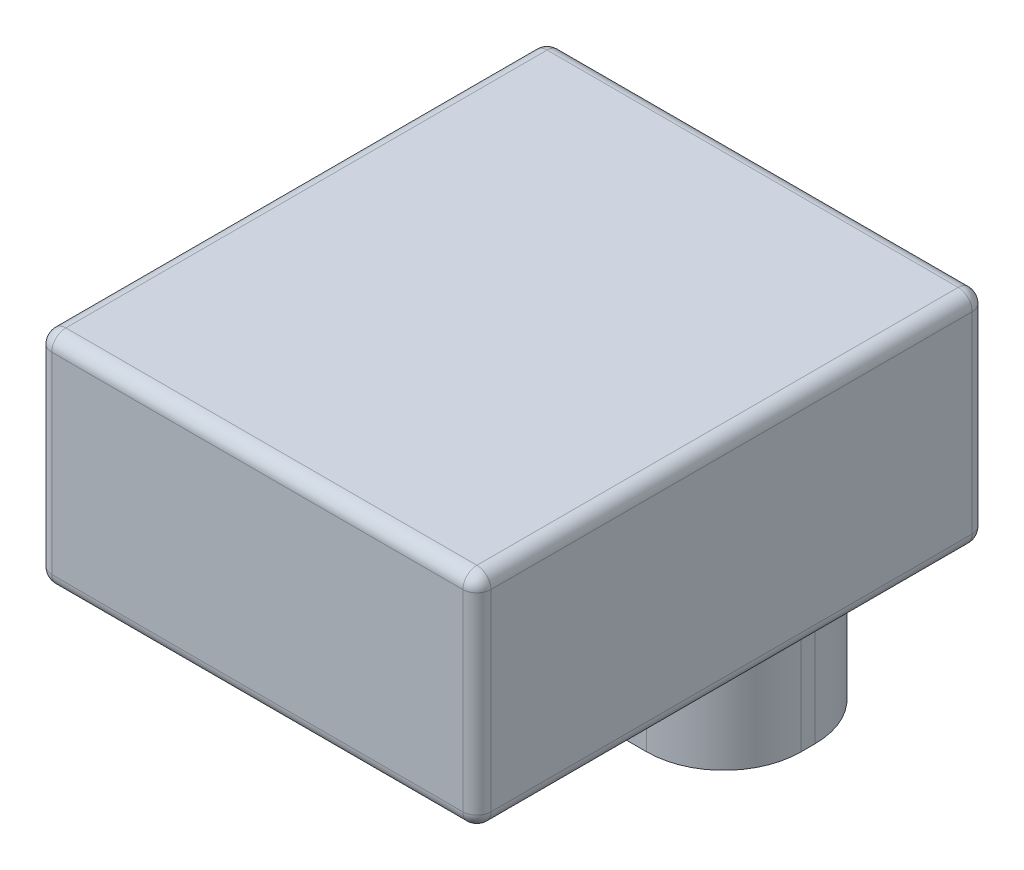
ISO-10303-21;
HEADER;
FILE_DESCRIPTION(('STEP AP214'),'2;1');
FILE_NAME('part.step','',(''),(''),'','','');
FILE_SCHEMA(('AUTOMOTIVE_DESIGN { 1 0 10303 214 1 1 1 1 }'));
ENDSEC;
DATA;
#1=APPLICATION_CONTEXT('core data for automotive mechanical design processes');
#2=APPLICATION_PROTOCOL_DEFINITION('international standard','automotive_design',2000,#1);
#3=PRODUCT_CONTEXT('',#1,'mechanical');
#4=PRODUCT('Part','Part','',(#3));
#5=PRODUCT_RELATED_PRODUCT_CATEGORY('part','',(#4));
#6=PRODUCT_DEFINITION_FORMATION('','',#4);
#7=PRODUCT_DEFINITION_CONTEXT('part definition',#1,'design');
#8=PRODUCT_DEFINITION('design','',#6,#7);
#9=PRODUCT_DEFINITION_SHAPE('','',#8);
#10=(LENGTH_UNIT() NAMED_UNIT(*) SI_UNIT(.MILLI.,.METRE.));
#11=(NAMED_UNIT(*) PLANE_ANGLE_UNIT() SI_UNIT($,.RADIAN.));
#12=(NAMED_UNIT(*) SI_UNIT($,.STERADIAN.) SOLID_ANGLE_UNIT());
#13=UNCERTAINTY_MEASURE_WITH_UNIT(LENGTH_MEASURE(1.E-05),#10,'distance_accuracy_value','');
#14=(GEOMETRIC_REPRESENTATION_CONTEXT(3) GLOBAL_UNCERTAINTY_ASSIGNED_CONTEXT((#13)) GLOBAL_UNIT_ASSIGNED_CONTEXT((#10,
#11,#12)) REPRESENTATION_CONTEXT('',''));
#15=CARTESIAN_POINT('',(0.,0.,0.));
#16=DIRECTION('',(0.,0.,1.));
#17=DIRECTION('',(1.,0.,0.));
#18=AXIS2_PLACEMENT_3D('',#15,#16,#17);
#19=CARTESIAN_POINT('',(0.,0.,0.));
#20=DIRECTION('',(0.,1.,0.));
#21=DIRECTION('',(0.,0.,1.));
#22=AXIS2_PLACEMENT_3D('',#19,#20,#21);
#23=PLANE('',#22);
#24=DIRECTION('',(-1.,0.,0.));
#25=VECTOR('',#24,1.);
#26=CARTESIAN_POINT('',(0.,0.,-34.3));
#27=LINE('',#26,#25);
#28=CARTESIAN_POINT('',(-29.3,0.,-34.3));
#29=VERTEX_POINT('',#28);
#30=CARTESIAN_POINT('',(29.3,0.,-34.3));
#31=VERTEX_POINT('',#30);
#32=EDGE_CURVE('E241',#29,#31,#27,.F.);
#33=ORIENTED_EDGE('',*,*,#32,.T.);
#34=DIRECTION('',(0.,0.,-1.));
#35=VECTOR('',#34,1.);
#36=CARTESIAN_POINT('',(29.3,0.,0.));
#37=LINE('',#36,#35);
#38=CARTESIAN_POINT('',(29.3,0.,34.3));
#39=VERTEX_POINT('',#38);
#40=EDGE_CURVE('E244',#31,#39,#37,.F.);
#41=ORIENTED_EDGE('',*,*,#40,.T.);
#42=DIRECTION('',(1.,0.,0.));
#43=VECTOR('',#42,1.);
#44=CARTESIAN_POINT('',(0.,0.,34.3));
#45=LINE('',#44,#43);
#46=CARTESIAN_POINT('',(-29.3,0.,34.3));
#47=VERTEX_POINT('',#46);
#48=EDGE_CURVE('E239',#39,#47,#45,.F.);
#49=ORIENTED_EDGE('',*,*,#48,.T.);
#50=DIRECTION('',(0.,0.,1.));
#51=VECTOR('',#50,1.);
#52=CARTESIAN_POINT('',(-29.3,0.,0.));
#53=LINE('',#52,#51);
#54=EDGE_CURVE('E237',#47,#29,#53,.F.);
#55=ORIENTED_EDGE('',*,*,#54,.T.);
#56=EDGE_LOOP('',(#33,#41,#49,#55));
#57=FACE_BOUND('',#56,.T.);
#58=DIRECTION('',(0.,0.,-1.));
#59=VECTOR('',#58,1.);
#60=CARTESIAN_POINT('',(-25.,0.,-5.2));
#61=LINE('',#60,#59);
#62=CARTESIAN_POINT('',(-25.,0.,-16.2));
#63=VERTEX_POINT('',#62);
#64=CARTESIAN_POINT('',(-25.,0.,-18.2));
#65=VERTEX_POINT('',#64);
#66=EDGE_CURVE('E313',#63,#65,#61,.T.);
#67=ORIENTED_EDGE('',*,*,#66,.F.);
#68=CARTESIAN_POINT('',(-14.,0.,-16.2));
#69=DIRECTION('',(0.,1.,0.));
#70=DIRECTION('',(0.,0.,1.));
#71=AXIS2_PLACEMENT_3D('',#68,#69,#70);
#72=CIRCLE('',#71,11.);
#73=CARTESIAN_POINT('',(-14.,0.,-5.2));
#74=VERTEX_POINT('',#73);
#75=EDGE_CURVE('E11',#63,#74,#72,.T.);
#76=ORIENTED_EDGE('',*,*,#75,.T.);
#77=DIRECTION('',(-1.,0.,0.));
#78=VECTOR('',#77,1.);
#79=CARTESIAN_POINT('',(-25.,0.,-5.2));
#80=LINE('',#79,#78);
#81=CARTESIAN_POINT('',(14.,0.,-5.2));
#82=VERTEX_POINT('',#81);
#83=EDGE_CURVE('E378',#82,#74,#80,.T.);
#84=ORIENTED_EDGE('',*,*,#83,.F.);
#85=CARTESIAN_POINT('',(14.,0.,-16.2));
#86=DIRECTION('',(0.,1.,0.));
#87=DIRECTION('',(0.,0.,1.));
#88=AXIS2_PLACEMENT_3D('',#85,#86,#87);
#89=CIRCLE('',#88,11.);
#90=CARTESIAN_POINT('',(25.,0.,-16.2));
#91=VERTEX_POINT('',#90);
#92=EDGE_CURVE('E340',#82,#91,#89,.T.);
#93=ORIENTED_EDGE('',*,*,#92,.T.);
#94=DIRECTION('',(0.,0.,1.));
#95=VECTOR('',#94,1.);
#96=CARTESIAN_POINT('',(25.,0.,-5.2));
#97=LINE('',#96,#95);
#98=CARTESIAN_POINT('',(25.,0.,-18.2));
#99=VERTEX_POINT('',#98);
#100=EDGE_CURVE('E347',#99,#91,#97,.T.);
#101=ORIENTED_EDGE('',*,*,#100,.F.);
#102=CARTESIAN_POINT('',(14.,0.,-18.2));
#103=DIRECTION('',(0.,1.,0.));
#104=DIRECTION('',(0.,0.,1.));
#105=AXIS2_PLACEMENT_3D('',#102,#103,#104);
#106=CIRCLE('',#105,11.);
#107=CARTESIAN_POINT('',(14.,0.,-29.2));
#108=VERTEX_POINT('',#107);
#109=EDGE_CURVE('E342',#99,#108,#106,.T.);
#110=ORIENTED_EDGE('',*,*,#109,.T.);
#111=DIRECTION('',(1.,0.,0.));
#112=VECTOR('',#111,1.);
#113=CARTESIAN_POINT('',(-25.,0.,-29.2));
#114=LINE('',#113,#112);
#115=CARTESIAN_POINT('',(-14.,0.,-29.2));
#116=VERTEX_POINT('',#115);
#117=EDGE_CURVE('E345',#116,#108,#114,.T.);
#118=ORIENTED_EDGE('',*,*,#117,.F.);
#119=CARTESIAN_POINT('',(-14.,0.,-18.2));
#120=DIRECTION('',(0.,1.,0.));
#121=DIRECTION('',(0.,0.,1.));
#122=AXIS2_PLACEMENT_3D('',#119,#120,#121);
#123=CIRCLE('',#122,11.);
#124=EDGE_CURVE('E44',#116,#65,#123,.T.);
#125=ORIENTED_EDGE('',*,*,#124,.T.);
#126=EDGE_LOOP('',(#67,#76,#84,#93,#101,#110,#118,#125));
#127=FACE_BOUND('',#126,.T.);
#128=ADVANCED_FACE('F36',(#57,#127),#23,.F.);
#129=CARTESIAN_POINT('',(31.3,24.14,-36.3));
#130=DIRECTION('',(-1.,0.,0.));
#131=DIRECTION('',(0.,0.,1.));
#132=AXIS2_PLACEMENT_3D('',#129,#130,#131);
#133=PLANE('',#132);
#134=DIRECTION('',(0.,-1.,0.));
#135=VECTOR('',#134,1.);
#136=CARTESIAN_POINT('',(31.3,24.14,34.3));
#137=LINE('',#136,#135);
#138=CARTESIAN_POINT('',(31.3,29.44,34.3));
#139=VERTEX_POINT('',#138);
#140=CARTESIAN_POINT('',(31.3,2.,34.3));
#141=VERTEX_POINT('',#140);
#142=EDGE_CURVE('E210',#139,#141,#137,.T.);
#143=ORIENTED_EDGE('',*,*,#142,.T.);
#144=DIRECTION('',(0.,0.,-1.));
#145=VECTOR('',#144,1.);
#146=CARTESIAN_POINT('',(31.3,2.,-36.3));
#147=LINE('',#146,#145);
#148=CARTESIAN_POINT('',(31.3,2.,-34.3));
#149=VERTEX_POINT('',#148);
#150=EDGE_CURVE('E217',#141,#149,#147,.T.);
#151=ORIENTED_EDGE('',*,*,#150,.T.);
#152=DIRECTION('',(0.,-1.,0.));
#153=VECTOR('',#152,1.);
#154=CARTESIAN_POINT('',(31.3,24.14,-34.3));
#155=LINE('',#154,#153);
#156=CARTESIAN_POINT('',(31.3,29.44,-34.3));
#157=VERTEX_POINT('',#156);
#158=EDGE_CURVE('E179',#149,#157,#155,.F.);
#159=ORIENTED_EDGE('',*,*,#158,.T.);
#160=DIRECTION('',(0.,0.,-1.));
#161=VECTOR('',#160,1.);
#162=CARTESIAN_POINT('',(31.3,29.44,36.3));
#163=LINE('',#162,#161);
#164=EDGE_CURVE('E208',#157,#139,#163,.F.);
#165=ORIENTED_EDGE('',*,*,#164,.T.);
#166=EDGE_LOOP('',(#143,#151,#159,#165));
#167=FACE_BOUND('',#166,.T.);
#168=ADVANCED_FACE('F404',(#167),#133,.F.);
#169=CARTESIAN_POINT('',(-31.3,24.14,-36.3));
#170=DIRECTION('',(0.,0.,1.));
#171=DIRECTION('',(1.,0.,0.));
#172=AXIS2_PLACEMENT_3D('',#169,#170,#171);
#173=PLANE('',#172);
#174=DIRECTION('',(-1.,0.,0.));
#175=VECTOR('',#174,1.);
#176=CARTESIAN_POINT('',(31.3,29.44,-36.3));
#177=LINE('',#176,#175);
#178=CARTESIAN_POINT('',(-29.3,29.44,-36.3));
#179=VERTEX_POINT('',#178);
#180=CARTESIAN_POINT('',(29.3,29.44,-36.3));
#181=VERTEX_POINT('',#180);
#182=EDGE_CURVE('E206',#179,#181,#177,.F.);
#183=ORIENTED_EDGE('',*,*,#182,.T.);
#184=DIRECTION('',(0.,-1.,0.));
#185=VECTOR('',#184,1.);
#186=CARTESIAN_POINT('',(29.3,24.14,-36.3));
#187=LINE('',#186,#185);
#188=CARTESIAN_POINT('',(29.3,2.,-36.3));
#189=VERTEX_POINT('',#188);
#190=EDGE_CURVE('E177',#181,#189,#187,.T.);
#191=ORIENTED_EDGE('',*,*,#190,.T.);
#192=DIRECTION('',(-1.,0.,0.));
#193=VECTOR('',#192,1.);
#194=CARTESIAN_POINT('',(-31.3,2.,-36.3));
#195=LINE('',#194,#193);
#196=CARTESIAN_POINT('',(-29.3,2.,-36.3));
#197=VERTEX_POINT('',#196);
#198=EDGE_CURVE('E195',#189,#197,#195,.T.);
#199=ORIENTED_EDGE('',*,*,#198,.T.);
#200=DIRECTION('',(0.,-1.,0.));
#201=VECTOR('',#200,1.);
#202=CARTESIAN_POINT('',(-29.3,24.14,-36.3));
#203=LINE('',#202,#201);
#204=EDGE_CURVE('E201',#197,#179,#203,.F.);
#205=ORIENTED_EDGE('',*,*,#204,.T.);
#206=EDGE_LOOP('',(#183,#191,#199,#205));
#207=FACE_BOUND('',#206,.T.);
#208=ADVANCED_FACE('F204',(#207),#173,.F.);
#209=CARTESIAN_POINT('',(-31.3,24.14,-36.3));
#210=DIRECTION('',(1.,0.,0.));
#211=DIRECTION('',(0.,0.,-1.));
#212=AXIS2_PLACEMENT_3D('',#209,#210,#211);
#213=PLANE('',#212);
#214=DIRECTION('',(0.,-1.,0.));
#215=VECTOR('',#214,1.);
#216=CARTESIAN_POINT('',(-31.3,24.14,-34.3));
#217=LINE('',#216,#215);
#218=CARTESIAN_POINT('',(-31.3,29.44,-34.3));
#219=VERTEX_POINT('',#218);
#220=CARTESIAN_POINT('',(-31.3,2.,-34.3));
#221=VERTEX_POINT('',#220);
#222=EDGE_CURVE('E232',#219,#221,#217,.T.);
#223=ORIENTED_EDGE('',*,*,#222,.T.);
#224=DIRECTION('',(0.,0.,1.));
#225=VECTOR('',#224,1.);
#226=CARTESIAN_POINT('',(-31.3,2.,-36.3));
#227=LINE('',#226,#225);
#228=CARTESIAN_POINT('',(-31.3,2.,34.3));
#229=VERTEX_POINT('',#228);
#230=EDGE_CURVE('E235',#221,#229,#227,.T.);
#231=ORIENTED_EDGE('',*,*,#230,.T.);
#232=DIRECTION('',(0.,-1.,0.));
#233=VECTOR('',#232,1.);
#234=CARTESIAN_POINT('',(-31.3,24.14,34.3));
#235=LINE('',#234,#233);
#236=CARTESIAN_POINT('',(-31.3,29.44,34.3));
#237=VERTEX_POINT('',#236);
#238=EDGE_CURVE('E230',#229,#237,#235,.F.);
#239=ORIENTED_EDGE('',*,*,#238,.T.);
#240=DIRECTION('',(0.,0.,1.));
#241=VECTOR('',#240,1.);
#242=CARTESIAN_POINT('',(-31.3,29.44,-36.3));
#243=LINE('',#242,#241);
#244=EDGE_CURVE('E228',#237,#219,#243,.F.);
#245=ORIENTED_EDGE('',*,*,#244,.T.);
#246=EDGE_LOOP('',(#223,#231,#239,#245));
#247=FACE_BOUND('',#246,.T.);
#248=ADVANCED_FACE('F443',(#247),#213,.F.);
#249=CARTESIAN_POINT('',(-31.3,24.14,36.3));
#250=DIRECTION('',(0.,0.,-1.));
#251=DIRECTION('',(-1.,0.,0.));
#252=AXIS2_PLACEMENT_3D('',#249,#250,#251);
#253=PLANE('',#252);
#254=DIRECTION('',(1.,0.,0.));
#255=VECTOR('',#254,1.);
#256=CARTESIAN_POINT('',(-31.3,29.44,36.3));
#257=LINE('',#256,#255);
#258=CARTESIAN_POINT('',(29.3,29.44,36.3));
#259=VERTEX_POINT('',#258);
#260=CARTESIAN_POINT('',(-29.3,29.44,36.3));
#261=VERTEX_POINT('',#260);
#262=EDGE_CURVE('E250',#259,#261,#257,.F.);
#263=ORIENTED_EDGE('',*,*,#262,.T.);
#264=DIRECTION('',(0.,-1.,0.));
#265=VECTOR('',#264,1.);
#266=CARTESIAN_POINT('',(-29.3,24.14,36.3));
#267=LINE('',#266,#265);
#268=CARTESIAN_POINT('',(-29.3,2.,36.3));
#269=VERTEX_POINT('',#268);
#270=EDGE_CURVE('E252',#261,#269,#267,.T.);
#271=ORIENTED_EDGE('',*,*,#270,.T.);
#272=DIRECTION('',(1.,0.,0.));
#273=VECTOR('',#272,1.);
#274=CARTESIAN_POINT('',(-31.3,2.,36.3));
#275=LINE('',#274,#273);
#276=CARTESIAN_POINT('',(29.3,2.,36.3));
#277=VERTEX_POINT('',#276);
#278=EDGE_CURVE('E246',#269,#277,#275,.T.);
#279=ORIENTED_EDGE('',*,*,#278,.T.);
#280=DIRECTION('',(0.,-1.,0.));
#281=VECTOR('',#280,1.);
#282=CARTESIAN_POINT('',(29.3,24.14,36.3));
#283=LINE('',#282,#281);
#284=EDGE_CURVE('E248',#277,#259,#283,.F.);
#285=ORIENTED_EDGE('',*,*,#284,.T.);
#286=EDGE_LOOP('',(#263,#271,#279,#285));
#287=FACE_BOUND('',#286,.T.);
#288=ADVANCED_FACE('F440',(#287),#253,.F.);
#289=CARTESIAN_POINT('',(-25.,-19.,-5.2));
#290=DIRECTION('',(1.,0.,0.));
#291=DIRECTION('',(0.,0.,-1.));
#292=AXIS2_PLACEMENT_3D('',#289,#290,#291);
#293=PLANE('',#292);
#294=ORIENTED_EDGE('',*,*,#66,.T.);
#295=DIRECTION('',(0.,1.,0.));
#296=VECTOR('',#295,1.);
#297=CARTESIAN_POINT('',(-25.,-19.,-18.2));
#298=LINE('',#297,#296);
#299=CARTESIAN_POINT('',(-25.,-19.,-18.2));
#300=VERTEX_POINT('',#299);
#301=EDGE_CURVE('E338',#65,#300,#298,.F.);
#302=ORIENTED_EDGE('',*,*,#301,.T.);
#303=DIRECTION('',(0.,0.,-1.));
#304=VECTOR('',#303,1.);
#305=CARTESIAN_POINT('',(-25.,-19.,-5.2));
#306=LINE('',#305,#304);
#307=CARTESIAN_POINT('',(-25.,-19.,-16.2));
#308=VERTEX_POINT('',#307);
#309=EDGE_CURVE('E372',#308,#300,#306,.T.);
#310=ORIENTED_EDGE('',*,*,#309,.F.);
#311=DIRECTION('',(0.,1.,0.));
#312=VECTOR('',#311,1.);
#313=CARTESIAN_POINT('',(-25.,-19.,-16.2));
#314=LINE('',#313,#312);
#315=EDGE_CURVE('E336',#308,#63,#314,.T.);
#316=ORIENTED_EDGE('',*,*,#315,.T.);
#317=EDGE_LOOP('',(#294,#302,#310,#316));
#318=FACE_BOUND('',#317,.T.);
#319=ADVANCED_FACE('F438',(#318),#293,.F.);
#320=CARTESIAN_POINT('',(-25.,-19.,-29.2));
#321=DIRECTION('',(0.,0.,1.));
#322=DIRECTION('',(1.,0.,0.));
#323=AXIS2_PLACEMENT_3D('',#320,#321,#322);
#324=PLANE('',#323);
#325=ORIENTED_EDGE('',*,*,#117,.T.);
#326=DIRECTION('',(0.,1.,0.));
#327=VECTOR('',#326,1.);
#328=CARTESIAN_POINT('',(14.,-19.,-29.2));
#329=LINE('',#328,#327);
#330=CARTESIAN_POINT('',(14.,-19.,-29.2));
#331=VERTEX_POINT('',#330);
#332=EDGE_CURVE('E334',#108,#331,#329,.F.);
#333=ORIENTED_EDGE('',*,*,#332,.T.);
#334=DIRECTION('',(1.,0.,0.));
#335=VECTOR('',#334,1.);
#336=CARTESIAN_POINT('',(-25.,-19.,-29.2));
#337=LINE('',#336,#335);
#338=CARTESIAN_POINT('',(-14.,-19.,-29.2));
#339=VERTEX_POINT('',#338);
#340=EDGE_CURVE('E365',#339,#331,#337,.T.);
#341=ORIENTED_EDGE('',*,*,#340,.F.);
#342=DIRECTION('',(0.,1.,0.));
#343=VECTOR('',#342,1.);
#344=CARTESIAN_POINT('',(-14.,-19.,-29.2));
#345=LINE('',#344,#343);
#346=EDGE_CURVE('E331',#339,#116,#345,.T.);
#347=ORIENTED_EDGE('',*,*,#346,.T.);
#348=EDGE_LOOP('',(#325,#333,#341,#347));
#349=FACE_BOUND('',#348,.T.);
#350=ADVANCED_FACE('F352',(#349),#324,.F.);
#351=CARTESIAN_POINT('',(25.,-19.,-5.2));
#352=DIRECTION('',(-1.,0.,0.));
#353=DIRECTION('',(0.,0.,1.));
#354=AXIS2_PLACEMENT_3D('',#351,#352,#353);
#355=PLANE('',#354);
#356=ORIENTED_EDGE('',*,*,#100,.T.);
#357=DIRECTION('',(0.,1.,0.));
#358=VECTOR('',#357,1.);
#359=CARTESIAN_POINT('',(25.,-19.,-16.2));
#360=LINE('',#359,#358);
#361=CARTESIAN_POINT('',(25.,-19.,-16.2));
#362=VERTEX_POINT('',#361);
#363=EDGE_CURVE('E321',#91,#362,#360,.F.);
#364=ORIENTED_EDGE('',*,*,#363,.T.);
#365=DIRECTION('',(0.,0.,1.));
#366=VECTOR('',#365,1.);
#367=CARTESIAN_POINT('',(25.,-19.,-5.2));
#368=LINE('',#367,#366);
#369=CARTESIAN_POINT('',(25.,-19.,-18.2));
#370=VERTEX_POINT('',#369);
#371=EDGE_CURVE('E363',#370,#362,#368,.T.);
#372=ORIENTED_EDGE('',*,*,#371,.F.);
#373=DIRECTION('',(0.,1.,0.));
#374=VECTOR('',#373,1.);
#375=CARTESIAN_POINT('',(25.,-19.,-18.2));
#376=LINE('',#375,#374);
#377=EDGE_CURVE('E318',#370,#99,#376,.T.);
#378=ORIENTED_EDGE('',*,*,#377,.T.);
#379=EDGE_LOOP('',(#356,#364,#372,#378));
#380=FACE_BOUND('',#379,.T.);
#381=ADVANCED_FACE('F367',(#380),#355,.F.);
#382=CARTESIAN_POINT('',(-25.,-19.,-5.2));
#383=DIRECTION('',(0.,0.,-1.));
#384=DIRECTION('',(-1.,0.,0.));
#385=AXIS2_PLACEMENT_3D('',#382,#383,#384);
#386=PLANE('',#385);
#387=DIRECTION('',(-1.,0.,0.));
#388=VECTOR('',#387,1.);
#389=CARTESIAN_POINT('',(-25.,-19.,-5.2));
#390=LINE('',#389,#388);
#391=CARTESIAN_POINT('',(14.,-19.,-5.2));
#392=VERTEX_POINT('',#391);
#393=CARTESIAN_POINT('',(-14.,-19.,-5.2));
#394=VERTEX_POINT('',#393);
#395=EDGE_CURVE('E202',#392,#394,#390,.T.);
#396=ORIENTED_EDGE('',*,*,#395,.F.);
#397=DIRECTION('',(0.,1.,0.));
#398=VECTOR('',#397,1.);
#399=CARTESIAN_POINT('',(14.,-19.,-5.2));
#400=LINE('',#399,#398);
#401=EDGE_CURVE('E315',#392,#82,#400,.T.);
#402=ORIENTED_EDGE('',*,*,#401,.T.);
#403=ORIENTED_EDGE('',*,*,#83,.T.);
#404=DIRECTION('',(0.,1.,0.));
#405=VECTOR('',#404,1.);
#406=CARTESIAN_POINT('',(-14.,-19.,-5.2));
#407=LINE('',#406,#405);
#408=EDGE_CURVE('E254',#74,#394,#407,.F.);
#409=ORIENTED_EDGE('',*,*,#408,.T.);
#410=EDGE_LOOP('',(#396,#402,#403,#409));
#411=FACE_BOUND('',#410,.T.);
#412=ADVANCED_FACE('F699',(#411),#386,.F.);
#413=CARTESIAN_POINT('',(0.,-19.,0.));
#414=DIRECTION('',(0.,-1.,0.));
#415=DIRECTION('',(0.,0.,-1.));
#416=AXIS2_PLACEMENT_3D('',#413,#414,#415);
#417=PLANE('',#416);
#418=ORIENTED_EDGE('',*,*,#371,.T.);
#419=CARTESIAN_POINT('',(14.,-19.,-16.2));
#420=DIRECTION('',(0.,-1.,0.));
#421=DIRECTION('',(0.,0.,-1.));
#422=AXIS2_PLACEMENT_3D('',#419,#420,#421);
#423=CIRCLE('',#422,11.);
#424=EDGE_CURVE('E329',#362,#392,#423,.T.);
#425=ORIENTED_EDGE('',*,*,#424,.T.);
#426=ORIENTED_EDGE('',*,*,#395,.T.);
#427=CARTESIAN_POINT('',(-14.,-19.,-16.2));
#428=DIRECTION('',(0.,-1.,0.));
#429=DIRECTION('',(0.,0.,-1.));
#430=AXIS2_PLACEMENT_3D('',#427,#428,#429);
#431=CIRCLE('',#430,11.);
#432=EDGE_CURVE('E323',#394,#308,#431,.T.);
#433=ORIENTED_EDGE('',*,*,#432,.T.);
#434=ORIENTED_EDGE('',*,*,#309,.T.);
#435=CARTESIAN_POINT('',(-14.,-19.,-18.2));
#436=DIRECTION('',(0.,-1.,0.));
#437=DIRECTION('',(0.,0.,-1.));
#438=AXIS2_PLACEMENT_3D('',#435,#436,#437);
#439=CIRCLE('',#438,11.);
#440=EDGE_CURVE('E325',#300,#339,#439,.T.);
#441=ORIENTED_EDGE('',*,*,#440,.T.);
#442=ORIENTED_EDGE('',*,*,#340,.T.);
#443=CARTESIAN_POINT('',(14.,-19.,-18.2));
#444=DIRECTION('',(0.,-1.,0.));
#445=DIRECTION('',(0.,0.,-1.));
#446=AXIS2_PLACEMENT_3D('',#443,#444,#445);
#447=CIRCLE('',#446,11.);
#448=EDGE_CURVE('E327',#331,#370,#447,.T.);
#449=ORIENTED_EDGE('',*,*,#448,.T.);
#450=EDGE_LOOP('',(#418,#425,#426,#433,#434,#441,#442,#449));
#451=FACE_BOUND('',#450,.T.);
#452=ADVANCED_FACE('F362',(#451),#417,.T.);
#453=CARTESIAN_POINT('',(0.,31.44,0.));
#454=DIRECTION('',(0.,1.,0.));
#455=DIRECTION('',(0.,0.,1.));
#456=AXIS2_PLACEMENT_3D('',#453,#454,#455);
#457=PLANE('',#456);
#458=DIRECTION('',(1.,0.,0.));
#459=VECTOR('',#458,1.);
#460=CARTESIAN_POINT('',(31.3,31.44,34.3));
#461=LINE('',#460,#459);
#462=CARTESIAN_POINT('',(-29.3,31.44,34.3));
#463=VERTEX_POINT('',#462);
#464=CARTESIAN_POINT('',(29.3,31.44,34.3));
#465=VERTEX_POINT('',#464);
#466=EDGE_CURVE('E221',#463,#465,#461,.T.);
#467=ORIENTED_EDGE('',*,*,#466,.T.);
#468=DIRECTION('',(0.,0.,-1.));
#469=VECTOR('',#468,1.);
#470=CARTESIAN_POINT('',(29.3,31.44,-36.3));
#471=LINE('',#470,#469);
#472=CARTESIAN_POINT('',(29.3,31.44,-34.3));
#473=VERTEX_POINT('',#472);
#474=EDGE_CURVE('E226',#465,#473,#471,.T.);
#475=ORIENTED_EDGE('',*,*,#474,.T.);
#476=DIRECTION('',(-1.,0.,0.));
#477=VECTOR('',#476,1.);
#478=CARTESIAN_POINT('',(-31.3,31.44,-34.3));
#479=LINE('',#478,#477);
#480=CARTESIAN_POINT('',(-29.3,31.44,-34.3));
#481=VERTEX_POINT('',#480);
#482=EDGE_CURVE('E223',#473,#481,#479,.T.);
#483=ORIENTED_EDGE('',*,*,#482,.T.);
#484=DIRECTION('',(0.,0.,1.));
#485=VECTOR('',#484,1.);
#486=CARTESIAN_POINT('',(-29.3,31.44,36.3));
#487=LINE('',#486,#485);
#488=EDGE_CURVE('E219',#481,#463,#487,.T.);
#489=ORIENTED_EDGE('',*,*,#488,.T.);
#490=EDGE_LOOP('',(#467,#475,#483,#489));
#491=FACE_BOUND('',#490,.T.);
#492=ADVANCED_FACE('F649',(#491),#457,.T.);
#493=CARTESIAN_POINT('',(-29.3,24.14,34.3));
#494=DIRECTION('',(0.,-1.,0.));
#495=DIRECTION('',(0.,0.,-1.));
#496=AXIS2_PLACEMENT_3D('',#493,#494,#495);
#497=CYLINDRICAL_SURFACE('',#496,2.);
#498=CARTESIAN_POINT('',(-29.3,29.44,34.3));
#499=DIRECTION('',(0.,1.,0.));
#500=DIRECTION('',(0.,0.,1.));
#501=AXIS2_PLACEMENT_3D('',#498,#499,#500);
#502=CIRCLE('',#501,2.);
#503=EDGE_CURVE('E310',#237,#261,#502,.T.);
#504=ORIENTED_EDGE('',*,*,#503,.F.);
#505=ORIENTED_EDGE('',*,*,#238,.F.);
#506=CARTESIAN_POINT('',(-29.3,2.,34.3));
#507=DIRECTION('',(0.,-1.,0.));
#508=DIRECTION('',(0.,0.,-1.));
#509=AXIS2_PLACEMENT_3D('',#506,#507,#508);
#510=CIRCLE('',#509,2.);
#511=EDGE_CURVE('E307',#269,#229,#510,.T.);
#512=ORIENTED_EDGE('',*,*,#511,.F.);
#513=ORIENTED_EDGE('',*,*,#270,.F.);
#514=EDGE_LOOP('',(#504,#505,#512,#513));
#515=FACE_BOUND('',#514,.T.);
#516=ADVANCED_FACE('F639',(#515),#497,.T.);
#517=CARTESIAN_POINT('',(-29.3,29.44,34.3));
#518=DIRECTION('',(0.,0.,1.));
#519=DIRECTION('',(1.,0.,0.));
#520=AXIS2_PLACEMENT_3D('',#517,#518,#519);
#521=SPHERICAL_SURFACE('',#520,2.);
#522=CARTESIAN_POINT('',(-29.3,29.44,34.3));
#523=DIRECTION('',(0.,0.,1.));
#524=DIRECTION('',(1.,0.,0.));
#525=AXIS2_PLACEMENT_3D('',#522,#523,#524);
#526=CIRCLE('',#525,2.);
#527=EDGE_CURVE('E301',#237,#463,#526,.F.);
#528=ORIENTED_EDGE('',*,*,#527,.F.);
#529=ORIENTED_EDGE('',*,*,#503,.T.);
#530=CARTESIAN_POINT('',(-29.3,29.44,34.3));
#531=DIRECTION('',(-1.,0.,0.));
#532=DIRECTION('',(0.,0.,1.));
#533=AXIS2_PLACEMENT_3D('',#530,#531,#532);
#534=CIRCLE('',#533,2.);
#535=EDGE_CURVE('E304',#463,#261,#534,.F.);
#536=ORIENTED_EDGE('',*,*,#535,.F.);
#537=EDGE_LOOP('',(#528,#529,#536));
#538=FACE_BOUND('',#537,.T.);
#539=ADVANCED_FACE('F629',(#538),#521,.T.);
#540=CARTESIAN_POINT('',(-29.3,2.,34.3));
#541=DIRECTION('',(-1.,0.,0.));
#542=DIRECTION('',(0.,-1.,0.));
#543=AXIS2_PLACEMENT_3D('',#540,#541,#542);
#544=SPHERICAL_SURFACE('',#543,2.);
#545=CARTESIAN_POINT('',(-29.3,2.,34.3));
#546=DIRECTION('',(-1.,0.,0.));
#547=DIRECTION('',(0.,0.,1.));
#548=AXIS2_PLACEMENT_3D('',#545,#546,#547);
#549=CIRCLE('',#548,2.);
#550=EDGE_CURVE('E295',#269,#47,#549,.F.);
#551=ORIENTED_EDGE('',*,*,#550,.F.);
#552=ORIENTED_EDGE('',*,*,#511,.T.);
#553=CARTESIAN_POINT('',(-29.3,2.,34.3));
#554=DIRECTION('',(0.,0.,1.));
#555=DIRECTION('',(1.,0.,0.));
#556=AXIS2_PLACEMENT_3D('',#553,#554,#555);
#557=CIRCLE('',#556,2.);
#558=EDGE_CURVE('E298',#47,#229,#557,.F.);
#559=ORIENTED_EDGE('',*,*,#558,.F.);
#560=EDGE_LOOP('',(#551,#552,#559));
#561=FACE_BOUND('',#560,.T.);
#562=ADVANCED_FACE('F619',(#561),#544,.T.);
#563=CARTESIAN_POINT('',(0.,29.44,34.3));
#564=DIRECTION('',(-1.,0.,0.));
#565=DIRECTION('',(0.,0.,1.));
#566=AXIS2_PLACEMENT_3D('',#563,#564,#565);
#567=CYLINDRICAL_SURFACE('',#566,2.);
#568=ORIENTED_EDGE('',*,*,#535,.T.);
#569=ORIENTED_EDGE('',*,*,#262,.F.);
#570=CARTESIAN_POINT('',(29.3,29.44,34.3));
#571=DIRECTION('',(1.,0.,0.));
#572=DIRECTION('',(0.,0.,-1.));
#573=AXIS2_PLACEMENT_3D('',#570,#571,#572);
#574=CIRCLE('',#573,2.);
#575=EDGE_CURVE('E289',#465,#259,#574,.T.);
#576=ORIENTED_EDGE('',*,*,#575,.F.);
#577=ORIENTED_EDGE('',*,*,#466,.F.);
#578=EDGE_LOOP('',(#568,#569,#576,#577));
#579=FACE_BOUND('',#578,.T.);
#580=ADVANCED_FACE('F609',(#579),#567,.T.);
#581=CARTESIAN_POINT('',(-29.3,29.44,0.));
#582=DIRECTION('',(0.,0.,-1.));
#583=DIRECTION('',(-1.,0.,0.));
#584=AXIS2_PLACEMENT_3D('',#581,#582,#583);
#585=CYLINDRICAL_SURFACE('',#584,2.);
#586=ORIENTED_EDGE('',*,*,#527,.T.);
#587=ORIENTED_EDGE('',*,*,#488,.F.);
#588=CARTESIAN_POINT('',(-29.3,29.44,-34.3));
#589=DIRECTION('',(0.,0.,-1.));
#590=DIRECTION('',(-1.,0.,0.));
#591=AXIS2_PLACEMENT_3D('',#588,#589,#590);
#592=CIRCLE('',#591,2.);
#593=EDGE_CURVE('E286',#219,#481,#592,.T.);
#594=ORIENTED_EDGE('',*,*,#593,.F.);
#595=ORIENTED_EDGE('',*,*,#244,.F.);
#596=EDGE_LOOP('',(#586,#587,#594,#595));
#597=FACE_BOUND('',#596,.T.);
#598=ADVANCED_FACE('F600',(#597),#585,.T.);
#599=CARTESIAN_POINT('',(-29.3,24.14,-34.3));
#600=DIRECTION('',(0.,-1.,0.));
#601=DIRECTION('',(0.,0.,-1.));
#602=AXIS2_PLACEMENT_3D('',#599,#600,#601);
#603=CYLINDRICAL_SURFACE('',#602,2.);
#604=CARTESIAN_POINT('',(-29.3,2.,-34.3));
#605=DIRECTION('',(0.,-1.,0.));
#606=DIRECTION('',(0.,0.,-1.));
#607=AXIS2_PLACEMENT_3D('',#604,#605,#606);
#608=CIRCLE('',#607,2.);
#609=EDGE_CURVE('E280',#221,#197,#608,.T.);
#610=ORIENTED_EDGE('',*,*,#609,.F.);
#611=ORIENTED_EDGE('',*,*,#222,.F.);
#612=CARTESIAN_POINT('',(-29.3,29.44,-34.3));
#613=DIRECTION('',(0.,1.,0.));
#614=DIRECTION('',(0.,0.,1.));
#615=AXIS2_PLACEMENT_3D('',#612,#613,#614);
#616=CIRCLE('',#615,2.);
#617=EDGE_CURVE('E283',#179,#219,#616,.T.);
#618=ORIENTED_EDGE('',*,*,#617,.F.);
#619=ORIENTED_EDGE('',*,*,#204,.F.);
#620=EDGE_LOOP('',(#610,#611,#618,#619));
#621=FACE_BOUND('',#620,.T.);
#622=ADVANCED_FACE('F385',(#621),#603,.T.);
#623=CARTESIAN_POINT('',(-29.3,2.,-36.3));
#624=DIRECTION('',(0.,0.,1.));
#625=DIRECTION('',(1.,0.,0.));
#626=AXIS2_PLACEMENT_3D('',#623,#624,#625);
#627=CYLINDRICAL_SURFACE('',#626,2.);
#628=ORIENTED_EDGE('',*,*,#558,.T.);
#629=ORIENTED_EDGE('',*,*,#230,.F.);
#630=CARTESIAN_POINT('',(-29.3,2.,-34.3));
#631=DIRECTION('',(0.,0.,-1.));
#632=DIRECTION('',(-1.,0.,0.));
#633=AXIS2_PLACEMENT_3D('',#630,#631,#632);
#634=CIRCLE('',#633,2.);
#635=EDGE_CURVE('E278',#29,#221,#634,.T.);
#636=ORIENTED_EDGE('',*,*,#635,.F.);
#637=ORIENTED_EDGE('',*,*,#54,.F.);
#638=EDGE_LOOP('',(#628,#629,#636,#637));
#639=FACE_BOUND('',#638,.T.);
#640=ADVANCED_FACE('F416',(#639),#627,.T.);
#641=CARTESIAN_POINT('',(-31.3,2.,34.3));
#642=DIRECTION('',(1.,0.,0.));
#643=DIRECTION('',(0.,0.,-1.));
#644=AXIS2_PLACEMENT_3D('',#641,#642,#643);
#645=CYLINDRICAL_SURFACE('',#644,2.);
#646=ORIENTED_EDGE('',*,*,#550,.T.);
#647=ORIENTED_EDGE('',*,*,#48,.F.);
#648=CARTESIAN_POINT('',(29.3,2.,34.3));
#649=DIRECTION('',(1.,0.,0.));
#650=DIRECTION('',(0.,0.,-1.));
#651=AXIS2_PLACEMENT_3D('',#648,#649,#650);
#652=CIRCLE('',#651,2.);
#653=EDGE_CURVE('E275',#277,#39,#652,.T.);
#654=ORIENTED_EDGE('',*,*,#653,.F.);
#655=ORIENTED_EDGE('',*,*,#278,.F.);
#656=EDGE_LOOP('',(#646,#647,#654,#655));
#657=FACE_BOUND('',#656,.T.);
#658=ADVANCED_FACE('F573',(#657),#645,.T.);
#659=CARTESIAN_POINT('',(29.3,24.14,34.3));
#660=DIRECTION('',(0.,-1.,0.));
#661=DIRECTION('',(0.,0.,-1.));
#662=AXIS2_PLACEMENT_3D('',#659,#660,#661);
#663=CYLINDRICAL_SURFACE('',#662,2.);
#664=CARTESIAN_POINT('',(29.3,29.44,34.3));
#665=DIRECTION('',(0.,1.,0.));
#666=DIRECTION('',(0.,0.,1.));
#667=AXIS2_PLACEMENT_3D('',#664,#665,#666);
#668=CIRCLE('',#667,2.);
#669=EDGE_CURVE('E292',#259,#139,#668,.T.);
#670=ORIENTED_EDGE('',*,*,#669,.F.);
#671=ORIENTED_EDGE('',*,*,#284,.F.);
#672=CARTESIAN_POINT('',(29.3,2.,34.3));
#673=DIRECTION('',(0.,-1.,0.));
#674=DIRECTION('',(0.,0.,-1.));
#675=AXIS2_PLACEMENT_3D('',#672,#673,#674);
#676=CIRCLE('',#675,2.);
#677=EDGE_CURVE('E272',#141,#277,#676,.T.);
#678=ORIENTED_EDGE('',*,*,#677,.F.);
#679=ORIENTED_EDGE('',*,*,#142,.F.);
#680=EDGE_LOOP('',(#670,#671,#678,#679));
#681=FACE_BOUND('',#680,.T.);
#682=ADVANCED_FACE('F564',(#681),#663,.T.);
#683=CARTESIAN_POINT('',(29.3,29.44,34.3));
#684=DIRECTION('',(0.,0.,1.));
#685=DIRECTION('',(1.,0.,0.));
#686=AXIS2_PLACEMENT_3D('',#683,#684,#685);
#687=SPHERICAL_SURFACE('',#686,2.);
#688=ORIENTED_EDGE('',*,*,#575,.T.);
#689=ORIENTED_EDGE('',*,*,#669,.T.);
#690=CARTESIAN_POINT('',(29.3,29.44,34.3));
#691=DIRECTION('',(0.,0.,1.));
#692=DIRECTION('',(1.,0.,0.));
#693=AXIS2_PLACEMENT_3D('',#690,#691,#692);
#694=CIRCLE('',#693,2.);
#695=EDGE_CURVE('E269',#465,#139,#694,.F.);
#696=ORIENTED_EDGE('',*,*,#695,.F.);
#697=EDGE_LOOP('',(#688,#689,#696));
#698=FACE_BOUND('',#697,.T.);
#699=ADVANCED_FACE('F428',(#698),#687,.T.);
#700=CARTESIAN_POINT('',(-29.3,29.44,-34.3));
#701=DIRECTION('',(-1.,0.,0.));
#702=DIRECTION('',(0.,0.,1.));
#703=AXIS2_PLACEMENT_3D('',#700,#701,#702);
#704=SPHERICAL_SURFACE('',#703,2.);
#705=ORIENTED_EDGE('',*,*,#617,.T.);
#706=ORIENTED_EDGE('',*,*,#593,.T.);
#707=CARTESIAN_POINT('',(-29.3,29.44,-34.3));
#708=DIRECTION('',(-1.,0.,0.));
#709=DIRECTION('',(0.,0.,1.));
#710=AXIS2_PLACEMENT_3D('',#707,#708,#709);
#711=CIRCLE('',#710,2.);
#712=EDGE_CURVE('E267',#179,#481,#711,.F.);
#713=ORIENTED_EDGE('',*,*,#712,.F.);
#714=EDGE_LOOP('',(#705,#706,#713));
#715=FACE_BOUND('',#714,.T.);
#716=ADVANCED_FACE('F388',(#715),#704,.T.);
#717=CARTESIAN_POINT('',(-29.3,2.,-34.3));
#718=DIRECTION('',(-1.,0.,0.));
#719=DIRECTION('',(0.,-1.,0.));
#720=AXIS2_PLACEMENT_3D('',#717,#718,#719);
#721=SPHERICAL_SURFACE('',#720,2.);
#722=ORIENTED_EDGE('',*,*,#635,.T.);
#723=ORIENTED_EDGE('',*,*,#609,.T.);
#724=CARTESIAN_POINT('',(-29.3,2.,-34.3));
#725=DIRECTION('',(-1.,0.,0.));
#726=DIRECTION('',(0.,0.,1.));
#727=AXIS2_PLACEMENT_3D('',#724,#725,#726);
#728=CIRCLE('',#727,2.);
#729=EDGE_CURVE('E198',#29,#197,#728,.F.);
#730=ORIENTED_EDGE('',*,*,#729,.F.);
#731=EDGE_LOOP('',(#722,#723,#730));
#732=FACE_BOUND('',#731,.T.);
#733=ADVANCED_FACE('F418',(#732),#721,.T.);
#734=CARTESIAN_POINT('',(29.3,2.,34.3));
#735=DIRECTION('',(0.,0.,1.));
#736=DIRECTION('',(0.,-1.,0.));
#737=AXIS2_PLACEMENT_3D('',#734,#735,#736);
#738=SPHERICAL_SURFACE('',#737,2.);
#739=ORIENTED_EDGE('',*,*,#677,.T.);
#740=ORIENTED_EDGE('',*,*,#653,.T.);
#741=CARTESIAN_POINT('',(29.3,2.,34.3));
#742=DIRECTION('',(0.,0.,1.));
#743=DIRECTION('',(1.,0.,0.));
#744=AXIS2_PLACEMENT_3D('',#741,#742,#743);
#745=CIRCLE('',#744,2.);
#746=EDGE_CURVE('E263',#141,#39,#745,.F.);
#747=ORIENTED_EDGE('',*,*,#746,.F.);
#748=EDGE_LOOP('',(#739,#740,#747));
#749=FACE_BOUND('',#748,.T.);
#750=ADVANCED_FACE('F420',(#749),#738,.T.);
#751=CARTESIAN_POINT('',(29.3,29.44,0.));
#752=DIRECTION('',(0.,0.,1.));
#753=DIRECTION('',(1.,0.,0.));
#754=AXIS2_PLACEMENT_3D('',#751,#752,#753);
#755=CYLINDRICAL_SURFACE('',#754,2.);
#756=ORIENTED_EDGE('',*,*,#695,.T.);
#757=ORIENTED_EDGE('',*,*,#164,.F.);
#758=CARTESIAN_POINT('',(29.3,29.44,-34.3));
#759=DIRECTION('',(0.,0.,-1.));
#760=DIRECTION('',(-1.,0.,0.));
#761=AXIS2_PLACEMENT_3D('',#758,#759,#760);
#762=CIRCLE('',#761,2.);
#763=EDGE_CURVE('E260',#473,#157,#762,.T.);
#764=ORIENTED_EDGE('',*,*,#763,.F.);
#765=ORIENTED_EDGE('',*,*,#474,.F.);
#766=EDGE_LOOP('',(#756,#757,#764,#765));
#767=FACE_BOUND('',#766,.T.);
#768=ADVANCED_FACE('F400',(#767),#755,.T.);
#769=CARTESIAN_POINT('',(0.,29.44,-34.3));
#770=DIRECTION('',(1.,0.,0.));
#771=DIRECTION('',(0.,0.,-1.));
#772=AXIS2_PLACEMENT_3D('',#769,#770,#771);
#773=CYLINDRICAL_SURFACE('',#772,2.);
#774=ORIENTED_EDGE('',*,*,#712,.T.);
#775=ORIENTED_EDGE('',*,*,#482,.F.);
#776=CARTESIAN_POINT('',(29.3,29.44,-34.3));
#777=DIRECTION('',(1.,0.,0.));
#778=DIRECTION('',(0.,0.,-1.));
#779=AXIS2_PLACEMENT_3D('',#776,#777,#778);
#780=CIRCLE('',#779,2.);
#781=EDGE_CURVE('E192',#181,#473,#780,.T.);
#782=ORIENTED_EDGE('',*,*,#781,.F.);
#783=ORIENTED_EDGE('',*,*,#182,.F.);
#784=EDGE_LOOP('',(#774,#775,#782,#783));
#785=FACE_BOUND('',#784,.T.);
#786=ADVANCED_FACE('F392',(#785),#773,.T.);
#787=CARTESIAN_POINT('',(-31.3,2.,-34.3));
#788=DIRECTION('',(-1.,0.,0.));
#789=DIRECTION('',(0.,0.,1.));
#790=AXIS2_PLACEMENT_3D('',#787,#788,#789);
#791=CYLINDRICAL_SURFACE('',#790,2.);
#792=ORIENTED_EDGE('',*,*,#729,.T.);
#793=ORIENTED_EDGE('',*,*,#198,.F.);
#794=CARTESIAN_POINT('',(29.3,2.,-34.3));
#795=DIRECTION('',(1.,0.,0.));
#796=DIRECTION('',(0.,0.,-1.));
#797=AXIS2_PLACEMENT_3D('',#794,#795,#796);
#798=CIRCLE('',#797,2.);
#799=EDGE_CURVE('E184',#31,#189,#798,.T.);
#800=ORIENTED_EDGE('',*,*,#799,.F.);
#801=ORIENTED_EDGE('',*,*,#32,.F.);
#802=EDGE_LOOP('',(#792,#793,#800,#801));
#803=FACE_BOUND('',#802,.T.);
#804=ADVANCED_FACE('F196',(#803),#791,.T.);
#805=CARTESIAN_POINT('',(29.3,2.,-36.3));
#806=DIRECTION('',(0.,0.,-1.));
#807=DIRECTION('',(-1.,0.,0.));
#808=AXIS2_PLACEMENT_3D('',#805,#806,#807);
#809=CYLINDRICAL_SURFACE('',#808,2.);
#810=ORIENTED_EDGE('',*,*,#746,.T.);
#811=ORIENTED_EDGE('',*,*,#40,.F.);
#812=CARTESIAN_POINT('',(29.3,2.,-34.3));
#813=DIRECTION('',(0.,0.,-1.));
#814=DIRECTION('',(-1.,0.,0.));
#815=AXIS2_PLACEMENT_3D('',#812,#813,#814);
#816=CIRCLE('',#815,2.);
#817=EDGE_CURVE('E188',#149,#31,#816,.T.);
#818=ORIENTED_EDGE('',*,*,#817,.F.);
#819=ORIENTED_EDGE('',*,*,#150,.F.);
#820=EDGE_LOOP('',(#810,#811,#818,#819));
#821=FACE_BOUND('',#820,.T.);
#822=ADVANCED_FACE('F408',(#821),#809,.T.);
#823=CARTESIAN_POINT('',(29.3,29.44,-34.3));
#824=DIRECTION('',(0.,1.,0.));
#825=DIRECTION('',(0.,0.,1.));
#826=AXIS2_PLACEMENT_3D('',#823,#824,#825);
#827=SPHERICAL_SURFACE('',#826,2.);
#828=ORIENTED_EDGE('',*,*,#781,.T.);
#829=ORIENTED_EDGE('',*,*,#763,.T.);
#830=CARTESIAN_POINT('',(29.3,29.44,-34.3));
#831=DIRECTION('',(0.,1.,0.));
#832=DIRECTION('',(0.,0.,1.));
#833=AXIS2_PLACEMENT_3D('',#830,#831,#832);
#834=CIRCLE('',#833,2.);
#835=EDGE_CURVE('E181',#181,#157,#834,.F.);
#836=ORIENTED_EDGE('',*,*,#835,.F.);
#837=EDGE_LOOP('',(#828,#829,#836));
#838=FACE_BOUND('',#837,.T.);
#839=ADVANCED_FACE('F396',(#838),#827,.T.);
#840=CARTESIAN_POINT('',(29.3,2.,-34.3));
#841=DIRECTION('',(0.,-1.,0.));
#842=DIRECTION('',(0.,0.,-1.));
#843=AXIS2_PLACEMENT_3D('',#840,#841,#842);
#844=SPHERICAL_SURFACE('',#843,2.);
#845=ORIENTED_EDGE('',*,*,#817,.T.);
#846=ORIENTED_EDGE('',*,*,#799,.T.);
#847=CARTESIAN_POINT('',(29.3,2.,-34.3));
#848=DIRECTION('',(0.,-1.,0.));
#849=DIRECTION('',(0.,0.,-1.));
#850=AXIS2_PLACEMENT_3D('',#847,#848,#849);
#851=CIRCLE('',#850,2.);
#852=EDGE_CURVE('E173',#149,#189,#851,.F.);
#853=ORIENTED_EDGE('',*,*,#852,.F.);
#854=EDGE_LOOP('',(#845,#846,#853));
#855=FACE_BOUND('',#854,.T.);
#856=ADVANCED_FACE('F186',(#855),#844,.T.);
#857=CARTESIAN_POINT('',(29.3,24.14,-34.3));
#858=DIRECTION('',(0.,-1.,0.));
#859=DIRECTION('',(0.,0.,-1.));
#860=AXIS2_PLACEMENT_3D('',#857,#858,#859);
#861=CYLINDRICAL_SURFACE('',#860,2.);
#862=ORIENTED_EDGE('',*,*,#835,.T.);
#863=ORIENTED_EDGE('',*,*,#158,.F.);
#864=ORIENTED_EDGE('',*,*,#852,.T.);
#865=ORIENTED_EDGE('',*,*,#190,.F.);
#866=EDGE_LOOP('',(#862,#863,#864,#865));
#867=FACE_BOUND('',#866,.T.);
#868=ADVANCED_FACE('F175',(#867),#861,.T.);
#869=CARTESIAN_POINT('',(14.,-19.,-16.2));
#870=DIRECTION('',(0.,1.,0.));
#871=DIRECTION('',(0.,0.,1.));
#872=AXIS2_PLACEMENT_3D('',#869,#870,#871);
#873=CYLINDRICAL_SURFACE('',#872,11.);
#874=ORIENTED_EDGE('',*,*,#424,.F.);
#875=ORIENTED_EDGE('',*,*,#363,.F.);
#876=ORIENTED_EDGE('',*,*,#92,.F.);
#877=ORIENTED_EDGE('',*,*,#401,.F.);
#878=EDGE_LOOP('',(#874,#875,#876,#877));
#879=FACE_BOUND('',#878,.T.);
#880=ADVANCED_FACE('F452',(#879),#873,.T.);
#881=CARTESIAN_POINT('',(14.,-19.,-18.2));
#882=DIRECTION('',(0.,1.,0.));
#883=DIRECTION('',(0.,0.,1.));
#884=AXIS2_PLACEMENT_3D('',#881,#882,#883);
#885=CYLINDRICAL_SURFACE('',#884,11.);
#886=ORIENTED_EDGE('',*,*,#448,.F.);
#887=ORIENTED_EDGE('',*,*,#332,.F.);
#888=ORIENTED_EDGE('',*,*,#109,.F.);
#889=ORIENTED_EDGE('',*,*,#377,.F.);
#890=EDGE_LOOP('',(#886,#887,#888,#889));
#891=FACE_BOUND('',#890,.T.);
#892=ADVANCED_FACE('F358',(#891),#885,.T.);
#893=CARTESIAN_POINT('',(-14.,-19.,-18.2));
#894=DIRECTION('',(0.,1.,0.));
#895=DIRECTION('',(0.,0.,1.));
#896=AXIS2_PLACEMENT_3D('',#893,#894,#895);
#897=CYLINDRICAL_SURFACE('',#896,11.);
#898=ORIENTED_EDGE('',*,*,#440,.F.);
#899=ORIENTED_EDGE('',*,*,#301,.F.);
#900=ORIENTED_EDGE('',*,*,#124,.F.);
#901=ORIENTED_EDGE('',*,*,#346,.F.);
#902=EDGE_LOOP('',(#898,#899,#900,#901));
#903=FACE_BOUND('',#902,.T.);
#904=ADVANCED_FACE('F506',(#903),#897,.T.);
#905=CARTESIAN_POINT('',(-14.,-19.,-16.2));
#906=DIRECTION('',(0.,1.,0.));
#907=DIRECTION('',(0.,0.,1.));
#908=AXIS2_PLACEMENT_3D('',#905,#906,#907);
#909=CYLINDRICAL_SURFACE('',#908,11.);
#910=ORIENTED_EDGE('',*,*,#432,.F.);
#911=ORIENTED_EDGE('',*,*,#408,.F.);
#912=ORIENTED_EDGE('',*,*,#75,.F.);
#913=ORIENTED_EDGE('',*,*,#315,.F.);
#914=EDGE_LOOP('',(#910,#911,#912,#913));
#915=FACE_BOUND('',#914,.T.);
#916=ADVANCED_FACE('F38',(#915),#909,.T.);
#917=CLOSED_SHELL('',(#128,#168,#208,#248,#288,#319,#350,#381,#412,#452,#492,#516,#539,#562,
#580,#598,#622,#640,#658,#682,#699,#716,#733,#750,#768,#786,#804,#822,#839,#856,#868,#880,#892,
#904,#916));
#918=MANIFOLD_SOLID_BREP('B2',#917);
#919=ADVANCED_BREP_SHAPE_REPRESENTATION('',(#18,#918),#14);
#920=SHAPE_DEFINITION_REPRESENTATION(#9,#919);
ENDSEC;
END-ISO-10303-21;
